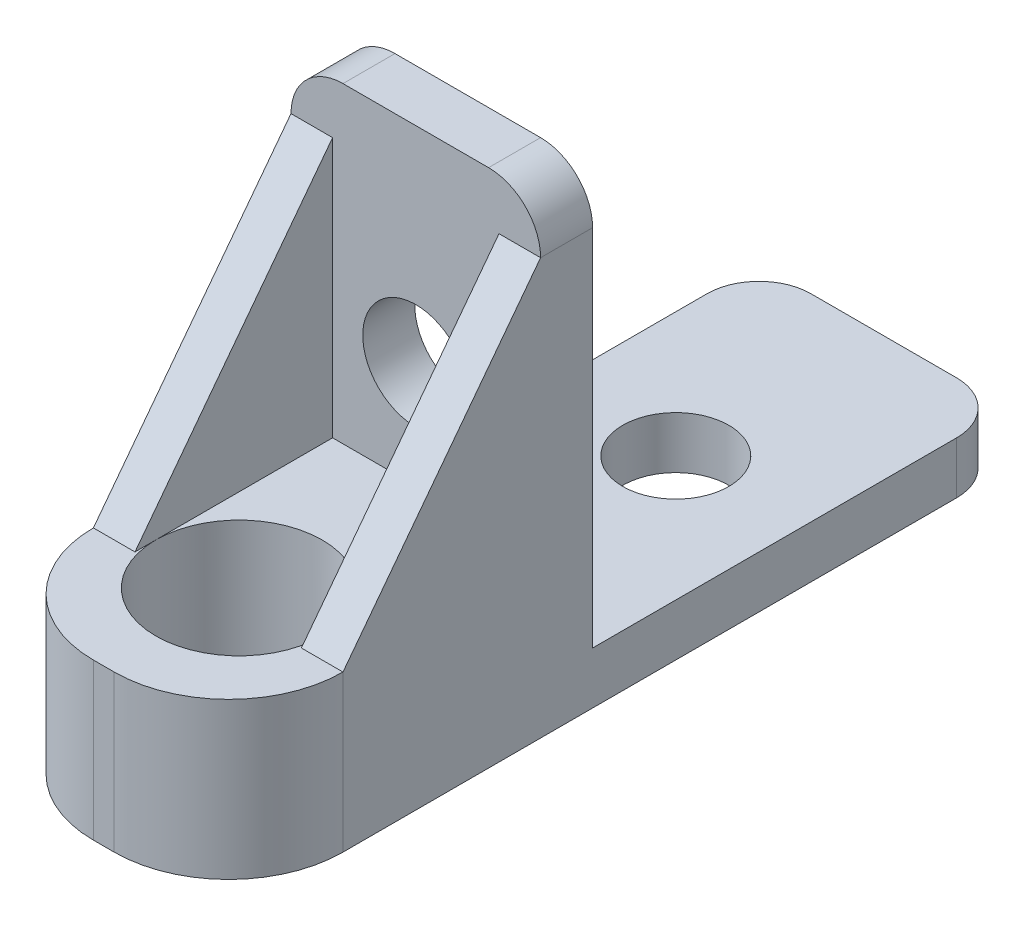
ISO-10303-21;
HEADER;
FILE_DESCRIPTION(('STEP AP214'),'2;1');
FILE_NAME('part.step','',(''),(''),'','','');
FILE_SCHEMA(('AUTOMOTIVE_DESIGN { 1 0 10303 214 1 1 1 1 }'));
ENDSEC;
DATA;
#1=APPLICATION_CONTEXT('core data for automotive mechanical design processes');
#2=APPLICATION_PROTOCOL_DEFINITION('international standard','automotive_design',2000,#1);
#3=PRODUCT_CONTEXT('',#1,'mechanical');
#4=PRODUCT('Part','Part','',(#3));
#5=PRODUCT_RELATED_PRODUCT_CATEGORY('part','',(#4));
#6=PRODUCT_DEFINITION_FORMATION('','',#4);
#7=PRODUCT_DEFINITION_CONTEXT('part definition',#1,'design');
#8=PRODUCT_DEFINITION('design','',#6,#7);
#9=PRODUCT_DEFINITION_SHAPE('','',#8);
#10=(LENGTH_UNIT() NAMED_UNIT(*) SI_UNIT(.MILLI.,.METRE.));
#11=(NAMED_UNIT(*) PLANE_ANGLE_UNIT() SI_UNIT($,.RADIAN.));
#12=(NAMED_UNIT(*) SI_UNIT($,.STERADIAN.) SOLID_ANGLE_UNIT());
#13=UNCERTAINTY_MEASURE_WITH_UNIT(LENGTH_MEASURE(1.E-05),#10,'distance_accuracy_value','');
#14=(GEOMETRIC_REPRESENTATION_CONTEXT(3) GLOBAL_UNCERTAINTY_ASSIGNED_CONTEXT((#13)) GLOBAL_UNIT_ASSIGNED_CONTEXT((#10,
#11,#12)) REPRESENTATION_CONTEXT('',''));
#15=CARTESIAN_POINT('',(0.,0.,0.));
#16=DIRECTION('',(0.,0.,1.));
#17=DIRECTION('',(1.,0.,0.));
#18=AXIS2_PLACEMENT_3D('',#15,#16,#17);
#19=CARTESIAN_POINT('',(5.5,7.5,32.));
#20=DIRECTION('',(0.,1.,0.));
#21=DIRECTION('',(0.,0.,1.));
#22=AXIS2_PLACEMENT_3D('',#19,#20,#21);
#23=PLANE('',#22);
#24=CARTESIAN_POINT('',(6.,7.5,31.));
#25=DIRECTION('',(0.,1.,0.));
#26=DIRECTION('',(0.,0.,1.));
#27=AXIS2_PLACEMENT_3D('',#24,#25,#26);
#28=CIRCLE('',#27,4.00000000000001);
#29=CARTESIAN_POINT('',(10.,7.5,31.));
#30=VERTEX_POINT('',#29);
#31=CARTESIAN_POINT('',(2.,7.5,31.));
#32=VERTEX_POINT('',#31);
#33=EDGE_CURVE('E51',#30,#32,#28,.T.);
#34=ORIENTED_EDGE('',*,*,#33,.F.);
#35=DIRECTION('',(0.,0.,-1.));
#36=VECTOR('',#35,1.);
#37=CARTESIAN_POINT('',(10.,7.5,32.));
#38=LINE('',#37,#36);
#39=CARTESIAN_POINT('',(10.,7.5,22.5));
#40=VERTEX_POINT('',#39);
#41=EDGE_CURVE('E164',#30,#40,#38,.T.);
#42=ORIENTED_EDGE('',*,*,#41,.T.);
#43=DIRECTION('',(-1.,0.,0.));
#44=VECTOR('',#43,1.);
#45=CARTESIAN_POINT('',(12.,7.5,22.5));
#46=LINE('',#45,#44);
#47=CARTESIAN_POINT('',(2.00000000000001,7.5,22.5));
#48=VERTEX_POINT('',#47);
#49=EDGE_CURVE('E193',#40,#48,#46,.T.);
#50=ORIENTED_EDGE('',*,*,#49,.T.);
#51=DIRECTION('',(0.,0.,1.));
#52=VECTOR('',#51,1.);
#53=CARTESIAN_POINT('',(2.,7.5,22.5));
#54=LINE('',#53,#52);
#55=EDGE_CURVE('E167',#48,#32,#54,.T.);
#56=ORIENTED_EDGE('',*,*,#55,.T.);
#57=EDGE_LOOP('',(#34,#42,#50,#56));
#58=FACE_BOUND('',#57,.T.);
#59=ADVANCED_FACE('F37',(#58),#23,.T.);
#60=CARTESIAN_POINT('',(6.50000000000001,2.5,32.));
#61=DIRECTION('',(0.,1.,0.));
#62=DIRECTION('',(0.,0.,1.));
#63=AXIS2_PLACEMENT_3D('',#60,#61,#62);
#64=PLANE('',#63);
#65=DIRECTION('',(-1.,0.,0.));
#66=VECTOR('',#65,1.);
#67=CARTESIAN_POINT('',(0.,2.5,20.));
#68=LINE('',#67,#66);
#69=CARTESIAN_POINT('',(12.,2.5,20.));
#70=VERTEX_POINT('',#69);
#71=CARTESIAN_POINT('',(0.,2.5,20.));
#72=VERTEX_POINT('',#71);
#73=EDGE_CURVE('E212',#70,#72,#68,.T.);
#74=ORIENTED_EDGE('',*,*,#73,.F.);
#75=DIRECTION('',(0.,0.,-1.));
#76=VECTOR('',#75,1.);
#77=CARTESIAN_POINT('',(12.,2.5,2.50000000000002));
#78=LINE('',#77,#76);
#79=CARTESIAN_POINT('',(12.,2.5,2.50000000000002));
#80=VERTEX_POINT('',#79);
#81=EDGE_CURVE('E231',#70,#80,#78,.T.);
#82=ORIENTED_EDGE('',*,*,#81,.T.);
#83=CARTESIAN_POINT('',(9.5,2.5,2.5));
#84=DIRECTION('',(0.,1.,0.));
#85=DIRECTION('',(0.,0.,-1.));
#86=AXIS2_PLACEMENT_3D('',#83,#84,#85);
#87=CIRCLE('',#86,2.5);
#88=CARTESIAN_POINT('',(9.49999999999998,2.5,0.));
#89=VERTEX_POINT('',#88);
#90=EDGE_CURVE('E233',#80,#89,#87,.T.);
#91=ORIENTED_EDGE('',*,*,#90,.T.);
#92=DIRECTION('',(-1.,0.,0.));
#93=VECTOR('',#92,1.);
#94=CARTESIAN_POINT('',(2.50000000000002,2.5,0.));
#95=LINE('',#94,#93);
#96=CARTESIAN_POINT('',(2.5,2.5,0.));
#97=VERTEX_POINT('',#96);
#98=EDGE_CURVE('E236',#89,#97,#95,.T.);
#99=ORIENTED_EDGE('',*,*,#98,.T.);
#100=CARTESIAN_POINT('',(2.5,2.5,2.5));
#101=DIRECTION('',(0.,1.,0.));
#102=DIRECTION('',(0.,0.,-1.));
#103=AXIS2_PLACEMENT_3D('',#100,#101,#102);
#104=CIRCLE('',#103,2.5);
#105=CARTESIAN_POINT('',(0.,2.5,2.50000000000002));
#106=VERTEX_POINT('',#105);
#107=EDGE_CURVE('E238',#97,#106,#104,.T.);
#108=ORIENTED_EDGE('',*,*,#107,.T.);
#109=DIRECTION('',(0.,0.,1.));
#110=VECTOR('',#109,1.);
#111=CARTESIAN_POINT('',(0.,2.5,2.50000000000002));
#112=LINE('',#111,#110);
#113=EDGE_CURVE('E240',#106,#72,#112,.T.);
#114=ORIENTED_EDGE('',*,*,#113,.T.);
#115=EDGE_LOOP('',(#74,#82,#91,#99,#108,#114));
#116=FACE_BOUND('',#115,.T.);
#117=CARTESIAN_POINT('',(6.,2.5,10.));
#118=DIRECTION('',(0.,1.,0.));
#119=DIRECTION('',(0.,0.,1.));
#120=AXIS2_PLACEMENT_3D('',#117,#118,#119);
#121=CIRCLE('',#120,2.55);
#122=CARTESIAN_POINT('',(6.,2.5,12.55));
#123=VERTEX_POINT('',#122);
#124=EDGE_CURVE('E225',#123,#123,#121,.T.);
#125=ORIENTED_EDGE('',*,*,#124,.F.);
#126=EDGE_LOOP('',(#125));
#127=FACE_BOUND('',#126,.T.);
#128=ADVANCED_FACE('F322',(#116,#127),#64,.T.);
#129=CARTESIAN_POINT('',(6.50000000000001,0.,32.));
#130=DIRECTION('',(0.,1.,0.));
#131=DIRECTION('',(0.,0.,1.));
#132=AXIS2_PLACEMENT_3D('',#129,#130,#131);
#133=PLANE('',#132);
#134=CARTESIAN_POINT('',(6.50000000000001,0.,32.));
#135=DIRECTION('',(0.,1.,0.));
#136=DIRECTION('',(0.,0.,1.));
#137=AXIS2_PLACEMENT_3D('',#134,#135,#136);
#138=CIRCLE('',#137,5.5);
#139=CARTESIAN_POINT('',(6.49999999999997,0.,37.5));
#140=VERTEX_POINT('',#139);
#141=CARTESIAN_POINT('',(12.,0.,32.));
#142=VERTEX_POINT('',#141);
#143=EDGE_CURVE('E228',#140,#142,#138,.T.);
#144=ORIENTED_EDGE('',*,*,#143,.F.);
#145=DIRECTION('',(1.,0.,0.));
#146=VECTOR('',#145,1.);
#147=CARTESIAN_POINT('',(5.50000000000004,0.,37.5));
#148=LINE('',#147,#146);
#149=CARTESIAN_POINT('',(5.50000000000004,0.,37.5));
#150=VERTEX_POINT('',#149);
#151=EDGE_CURVE('E234',#150,#140,#148,.T.);
#152=ORIENTED_EDGE('',*,*,#151,.F.);
#153=CARTESIAN_POINT('',(5.5,0.,32.));
#154=DIRECTION('',(0.,1.,0.));
#155=DIRECTION('',(0.,0.,1.));
#156=AXIS2_PLACEMENT_3D('',#153,#154,#155);
#157=CIRCLE('',#156,5.5);
#158=CARTESIAN_POINT('',(0.,0.,32.));
#159=VERTEX_POINT('',#158);
#160=EDGE_CURVE('E256',#159,#150,#157,.T.);
#161=ORIENTED_EDGE('',*,*,#160,.F.);
#162=DIRECTION('',(0.,0.,1.));
#163=VECTOR('',#162,1.);
#164=CARTESIAN_POINT('',(0.,0.,2.50000000000002));
#165=LINE('',#164,#163);
#166=CARTESIAN_POINT('',(0.,0.,2.50000000000002));
#167=VERTEX_POINT('',#166);
#168=EDGE_CURVE('E254',#167,#159,#165,.T.);
#169=ORIENTED_EDGE('',*,*,#168,.F.);
#170=CARTESIAN_POINT('',(2.5,0.,2.5));
#171=DIRECTION('',(0.,1.,0.));
#172=DIRECTION('',(0.,0.,-1.));
#173=AXIS2_PLACEMENT_3D('',#170,#171,#172);
#174=CIRCLE('',#173,2.5);
#175=CARTESIAN_POINT('',(2.5,0.,0.));
#176=VERTEX_POINT('',#175);
#177=EDGE_CURVE('E252',#176,#167,#174,.T.);
#178=ORIENTED_EDGE('',*,*,#177,.F.);
#179=DIRECTION('',(-1.,0.,0.));
#180=VECTOR('',#179,1.);
#181=CARTESIAN_POINT('',(2.50000000000002,0.,0.));
#182=LINE('',#181,#180);
#183=CARTESIAN_POINT('',(9.49999999999998,0.,0.));
#184=VERTEX_POINT('',#183);
#185=EDGE_CURVE('E250',#184,#176,#182,.T.);
#186=ORIENTED_EDGE('',*,*,#185,.F.);
#187=CARTESIAN_POINT('',(9.5,0.,2.5));
#188=DIRECTION('',(0.,1.,0.));
#189=DIRECTION('',(0.,0.,-1.));
#190=AXIS2_PLACEMENT_3D('',#187,#188,#189);
#191=CIRCLE('',#190,2.5);
#192=CARTESIAN_POINT('',(12.,0.,2.50000000000002));
#193=VERTEX_POINT('',#192);
#194=EDGE_CURVE('E248',#193,#184,#191,.T.);
#195=ORIENTED_EDGE('',*,*,#194,.F.);
#196=DIRECTION('',(0.,0.,-1.));
#197=VECTOR('',#196,1.);
#198=CARTESIAN_POINT('',(12.,0.,2.50000000000002));
#199=LINE('',#198,#197);
#200=EDGE_CURVE('E246',#142,#193,#199,.T.);
#201=ORIENTED_EDGE('',*,*,#200,.F.);
#202=EDGE_LOOP('',(#144,#152,#161,#169,#178,#186,#195,#201));
#203=FACE_BOUND('',#202,.T.);
#204=CARTESIAN_POINT('',(6.,0.,10.));
#205=DIRECTION('',(0.,1.,0.));
#206=DIRECTION('',(0.,0.,1.));
#207=AXIS2_PLACEMENT_3D('',#204,#205,#206);
#208=CIRCLE('',#207,2.55);
#209=CARTESIAN_POINT('',(6.,0.,12.55));
#210=VERTEX_POINT('',#209);
#211=EDGE_CURVE('E224',#210,#210,#208,.T.);
#212=ORIENTED_EDGE('',*,*,#211,.T.);
#213=EDGE_LOOP('',(#212));
#214=FACE_BOUND('',#213,.T.);
#215=CARTESIAN_POINT('',(6.,0.,31.));
#216=DIRECTION('',(0.,1.,0.));
#217=DIRECTION('',(0.,0.,1.));
#218=AXIS2_PLACEMENT_3D('',#215,#216,#217);
#219=CIRCLE('',#218,4.);
#220=CARTESIAN_POINT('',(6.,0.,35.));
#221=VERTEX_POINT('',#220);
#222=EDGE_CURVE('E221',#221,#221,#219,.T.);
#223=ORIENTED_EDGE('',*,*,#222,.T.);
#224=EDGE_LOOP('',(#223));
#225=FACE_BOUND('',#224,.T.);
#226=ADVANCED_FACE('F361',(#203,#214,#225),#133,.F.);
#227=CARTESIAN_POINT('',(6.50000000000001,2.5,32.));
#228=DIRECTION('',(0.,-1.,0.));
#229=DIRECTION('',(0.,0.,-1.));
#230=AXIS2_PLACEMENT_3D('',#227,#228,#229);
#231=CYLINDRICAL_SURFACE('',#230,5.5);
#232=ORIENTED_EDGE('',*,*,#143,.T.);
#233=DIRECTION('',(0.,-1.,0.));
#234=VECTOR('',#233,1.);
#235=CARTESIAN_POINT('',(12.,2.5,32.));
#236=LINE('',#235,#234);
#237=CARTESIAN_POINT('',(12.,7.5,32.));
#238=VERTEX_POINT('',#237);
#239=EDGE_CURVE('E279',#238,#142,#236,.T.);
#240=ORIENTED_EDGE('',*,*,#239,.F.);
#241=CARTESIAN_POINT('',(6.50000000000001,7.5,32.));
#242=DIRECTION('',(0.,1.,0.));
#243=DIRECTION('',(0.,0.,1.));
#244=AXIS2_PLACEMENT_3D('',#241,#242,#243);
#245=CIRCLE('',#244,5.5);
#246=CARTESIAN_POINT('',(6.49999999999997,7.5,37.5));
#247=VERTEX_POINT('',#246);
#248=EDGE_CURVE('E202',#247,#238,#245,.T.);
#249=ORIENTED_EDGE('',*,*,#248,.F.);
#250=DIRECTION('',(0.,-1.,0.));
#251=VECTOR('',#250,1.);
#252=CARTESIAN_POINT('',(6.49999999999997,2.5,37.5));
#253=LINE('',#252,#251);
#254=EDGE_CURVE('E243',#247,#140,#253,.T.);
#255=ORIENTED_EDGE('',*,*,#254,.T.);
#256=EDGE_LOOP('',(#232,#240,#249,#255));
#257=FACE_BOUND('',#256,.T.);
#258=ADVANCED_FACE('F380',(#257),#231,.T.);
#259=CARTESIAN_POINT('',(12.,2.5,2.50000000000002));
#260=DIRECTION('',(-1.,0.,0.));
#261=DIRECTION('',(0.,0.,1.));
#262=AXIS2_PLACEMENT_3D('',#259,#260,#261);
#263=PLANE('',#262);
#264=DIRECTION('',(0.,-1.,0.));
#265=VECTOR('',#264,1.);
#266=CARTESIAN_POINT('',(12.,22.5,20.));
#267=LINE('',#266,#265);
#268=CARTESIAN_POINT('',(12.,20.,20.));
#269=VERTEX_POINT('',#268);
#270=EDGE_CURVE('E219',#269,#70,#267,.T.);
#271=ORIENTED_EDGE('',*,*,#270,.F.);
#272=DIRECTION('',(0.,0.,-1.));
#273=VECTOR('',#272,1.);
#274=CARTESIAN_POINT('',(12.,20.,22.5));
#275=LINE('',#274,#273);
#276=CARTESIAN_POINT('',(12.,20.,22.5));
#277=VERTEX_POINT('',#276);
#278=EDGE_CURVE('E294',#269,#277,#275,.F.);
#279=ORIENTED_EDGE('',*,*,#278,.T.);
#280=DIRECTION('',(0.,-0.796162194123102,0.605083267533558));
#281=VECTOR('',#280,1.);
#282=CARTESIAN_POINT('',(12.,20.,22.5));
#283=LINE('',#282,#281);
#284=EDGE_CURVE('E187',#277,#238,#283,.T.);
#285=ORIENTED_EDGE('',*,*,#284,.T.);
#286=ORIENTED_EDGE('',*,*,#239,.T.);
#287=ORIENTED_EDGE('',*,*,#200,.T.);
#288=DIRECTION('',(0.,-1.,0.));
#289=VECTOR('',#288,1.);
#290=CARTESIAN_POINT('',(12.,2.5,2.50000000000002));
#291=LINE('',#290,#289);
#292=EDGE_CURVE('E276',#80,#193,#291,.T.);
#293=ORIENTED_EDGE('',*,*,#292,.F.);
#294=ORIENTED_EDGE('',*,*,#81,.F.);
#295=EDGE_LOOP('',(#271,#279,#285,#286,#287,#293,#294));
#296=FACE_BOUND('',#295,.T.);
#297=ADVANCED_FACE('F318',(#296),#263,.F.);
#298=CARTESIAN_POINT('',(9.5,2.5,2.5));
#299=DIRECTION('',(0.,-1.,0.));
#300=DIRECTION('',(0.,0.,-1.));
#301=AXIS2_PLACEMENT_3D('',#298,#299,#300);
#302=CYLINDRICAL_SURFACE('',#301,2.5);
#303=ORIENTED_EDGE('',*,*,#194,.T.);
#304=DIRECTION('',(0.,-1.,0.));
#305=VECTOR('',#304,1.);
#306=CARTESIAN_POINT('',(9.49999999999998,2.5,0.));
#307=LINE('',#306,#305);
#308=EDGE_CURVE('E273',#89,#184,#307,.T.);
#309=ORIENTED_EDGE('',*,*,#308,.F.);
#310=ORIENTED_EDGE('',*,*,#90,.F.);
#311=ORIENTED_EDGE('',*,*,#292,.T.);
#312=EDGE_LOOP('',(#303,#309,#310,#311));
#313=FACE_BOUND('',#312,.T.);
#314=ADVANCED_FACE('F386',(#313),#302,.T.);
#315=CARTESIAN_POINT('',(2.50000000000002,2.5,0.));
#316=DIRECTION('',(0.,0.,1.));
#317=DIRECTION('',(1.,0.,0.));
#318=AXIS2_PLACEMENT_3D('',#315,#316,#317);
#319=PLANE('',#318);
#320=ORIENTED_EDGE('',*,*,#185,.T.);
#321=DIRECTION('',(0.,-1.,0.));
#322=VECTOR('',#321,1.);
#323=CARTESIAN_POINT('',(2.5,2.5,0.));
#324=LINE('',#323,#322);
#325=EDGE_CURVE('E270',#97,#176,#324,.T.);
#326=ORIENTED_EDGE('',*,*,#325,.F.);
#327=ORIENTED_EDGE('',*,*,#98,.F.);
#328=ORIENTED_EDGE('',*,*,#308,.T.);
#329=EDGE_LOOP('',(#320,#326,#327,#328));
#330=FACE_BOUND('',#329,.T.);
#331=ADVANCED_FACE('F389',(#330),#319,.F.);
#332=CARTESIAN_POINT('',(2.5,2.5,2.5));
#333=DIRECTION('',(0.,-1.,0.));
#334=DIRECTION('',(0.,0.,-1.));
#335=AXIS2_PLACEMENT_3D('',#332,#333,#334);
#336=CYLINDRICAL_SURFACE('',#335,2.5);
#337=ORIENTED_EDGE('',*,*,#177,.T.);
#338=DIRECTION('',(0.,-1.,0.));
#339=VECTOR('',#338,1.);
#340=CARTESIAN_POINT('',(0.,2.5,2.50000000000002));
#341=LINE('',#340,#339);
#342=EDGE_CURVE('E267',#106,#167,#341,.T.);
#343=ORIENTED_EDGE('',*,*,#342,.F.);
#344=ORIENTED_EDGE('',*,*,#107,.F.);
#345=ORIENTED_EDGE('',*,*,#325,.T.);
#346=EDGE_LOOP('',(#337,#343,#344,#345));
#347=FACE_BOUND('',#346,.T.);
#348=ADVANCED_FACE('F393',(#347),#336,.T.);
#349=CARTESIAN_POINT('',(0.,2.5,2.50000000000002));
#350=DIRECTION('',(1.,0.,0.));
#351=DIRECTION('',(0.,0.,-1.));
#352=AXIS2_PLACEMENT_3D('',#349,#350,#351);
#353=PLANE('',#352);
#354=DIRECTION('',(0.,-1.,0.));
#355=VECTOR('',#354,1.);
#356=CARTESIAN_POINT('',(0.,2.5,32.));
#357=LINE('',#356,#355);
#358=CARTESIAN_POINT('',(0.,7.5,32.));
#359=VERTEX_POINT('',#358);
#360=EDGE_CURVE('E264',#359,#159,#357,.T.);
#361=ORIENTED_EDGE('',*,*,#360,.F.);
#362=DIRECTION('',(0.,0.796162194123104,-0.605083267533556));
#363=VECTOR('',#362,1.);
#364=CARTESIAN_POINT('',(0.,7.5,32.));
#365=LINE('',#364,#363);
#366=CARTESIAN_POINT('',(0.,20.,22.5));
#367=VERTEX_POINT('',#366);
#368=EDGE_CURVE('E168',#359,#367,#365,.T.);
#369=ORIENTED_EDGE('',*,*,#368,.T.);
#370=DIRECTION('',(0.,0.,1.));
#371=VECTOR('',#370,1.);
#372=CARTESIAN_POINT('',(0.,20.,20.));
#373=LINE('',#372,#371);
#374=CARTESIAN_POINT('',(0.,20.,20.));
#375=VERTEX_POINT('',#374);
#376=EDGE_CURVE('E11',#367,#375,#373,.F.);
#377=ORIENTED_EDGE('',*,*,#376,.T.);
#378=DIRECTION('',(0.,-1.,0.));
#379=VECTOR('',#378,1.);
#380=CARTESIAN_POINT('',(0.,22.5,20.));
#381=LINE('',#380,#379);
#382=EDGE_CURVE('E215',#375,#72,#381,.T.);
#383=ORIENTED_EDGE('',*,*,#382,.T.);
#384=ORIENTED_EDGE('',*,*,#113,.F.);
#385=ORIENTED_EDGE('',*,*,#342,.T.);
#386=ORIENTED_EDGE('',*,*,#168,.T.);
#387=EDGE_LOOP('',(#361,#369,#377,#383,#384,#385,#386));
#388=FACE_BOUND('',#387,.T.);
#389=ADVANCED_FACE('F397',(#388),#353,.F.);
#390=CARTESIAN_POINT('',(5.5,2.5,32.));
#391=DIRECTION('',(0.,-1.,0.));
#392=DIRECTION('',(0.,0.,-1.));
#393=AXIS2_PLACEMENT_3D('',#390,#391,#392);
#394=CYLINDRICAL_SURFACE('',#393,5.5);
#395=ORIENTED_EDGE('',*,*,#160,.T.);
#396=DIRECTION('',(0.,-1.,0.));
#397=VECTOR('',#396,1.);
#398=CARTESIAN_POINT('',(5.50000000000004,2.5,37.5));
#399=LINE('',#398,#397);
#400=CARTESIAN_POINT('',(5.5,7.5,37.5));
#401=VERTEX_POINT('',#400);
#402=EDGE_CURVE('E261',#401,#150,#399,.T.);
#403=ORIENTED_EDGE('',*,*,#402,.F.);
#404=CARTESIAN_POINT('',(5.5,7.5,32.));
#405=DIRECTION('',(0.,1.,0.));
#406=DIRECTION('',(0.,0.,1.));
#407=AXIS2_PLACEMENT_3D('',#404,#405,#406);
#408=CIRCLE('',#407,5.5);
#409=EDGE_CURVE('E196',#359,#401,#408,.T.);
#410=ORIENTED_EDGE('',*,*,#409,.F.);
#411=ORIENTED_EDGE('',*,*,#360,.T.);
#412=EDGE_LOOP('',(#395,#403,#410,#411));
#413=FACE_BOUND('',#412,.T.);
#414=ADVANCED_FACE('F401',(#413),#394,.T.);
#415=CARTESIAN_POINT('',(5.50000000000004,2.5,37.5));
#416=DIRECTION('',(0.,0.,-1.));
#417=DIRECTION('',(-1.,0.,0.));
#418=AXIS2_PLACEMENT_3D('',#415,#416,#417);
#419=PLANE('',#418);
#420=ORIENTED_EDGE('',*,*,#151,.T.);
#421=ORIENTED_EDGE('',*,*,#254,.F.);
#422=DIRECTION('',(1.,0.,0.));
#423=VECTOR('',#422,1.);
#424=CARTESIAN_POINT('',(5.50000000000004,7.5,37.5));
#425=LINE('',#424,#423);
#426=EDGE_CURVE('E199',#401,#247,#425,.T.);
#427=ORIENTED_EDGE('',*,*,#426,.F.);
#428=ORIENTED_EDGE('',*,*,#402,.T.);
#429=EDGE_LOOP('',(#420,#421,#427,#428));
#430=FACE_BOUND('',#429,.T.);
#431=ADVANCED_FACE('F404',(#430),#419,.F.);
#432=CARTESIAN_POINT('',(6.,2.5,10.));
#433=DIRECTION('',(0.,-1.,0.));
#434=DIRECTION('',(0.,0.,-1.));
#435=AXIS2_PLACEMENT_3D('',#432,#433,#434);
#436=CYLINDRICAL_SURFACE('',#435,2.55);
#437=ORIENTED_EDGE('',*,*,#124,.T.);
#438=EDGE_LOOP('',(#437));
#439=FACE_BOUND('',#438,.T.);
#440=ORIENTED_EDGE('',*,*,#211,.F.);
#441=EDGE_LOOP('',(#440));
#442=FACE_BOUND('',#441,.T.);
#443=ADVANCED_FACE('F408',(#439,#442),#436,.F.);
#444=CARTESIAN_POINT('',(6.,2.5,31.));
#445=DIRECTION('',(0.,-1.,0.));
#446=DIRECTION('',(0.,0.,-1.));
#447=AXIS2_PLACEMENT_3D('',#444,#445,#446);
#448=CYLINDRICAL_SURFACE('',#447,4.);
#449=ORIENTED_EDGE('',*,*,#222,.F.);
#450=EDGE_LOOP('',(#449));
#451=FACE_BOUND('',#450,.T.);
#452=ORIENTED_EDGE('',*,*,#33,.T.);
#453=EDGE_CURVE('E154',#32,#30,#28,.T.);
#454=ORIENTED_EDGE('',*,*,#453,.T.);
#455=EDGE_LOOP('',(#452,#454));
#456=FACE_BOUND('',#455,.T.);
#457=ADVANCED_FACE('F155',(#451,#456),#448,.F.);
#458=CARTESIAN_POINT('',(0.,22.5,22.5));
#459=DIRECTION('',(0.,0.,-1.));
#460=DIRECTION('',(-1.,0.,0.));
#461=AXIS2_PLACEMENT_3D('',#458,#459,#460);
#462=PLANE('',#461);
#463=CARTESIAN_POINT('',(6.00000000000001,12.5,22.5));
#464=DIRECTION('',(0.,0.,1.));
#465=DIRECTION('',(1.,0.,0.));
#466=AXIS2_PLACEMENT_3D('',#463,#464,#465);
#467=CIRCLE('',#466,2.55);
#468=CARTESIAN_POINT('',(8.55000000000001,12.5,22.5));
#469=VERTEX_POINT('',#468);
#470=EDGE_CURVE('E204',#469,#469,#467,.T.);
#471=ORIENTED_EDGE('',*,*,#470,.F.);
#472=EDGE_LOOP('',(#471));
#473=FACE_BOUND('',#472,.T.);
#474=CARTESIAN_POINT('',(2.5,20.,22.5));
#475=DIRECTION('',(0.,0.,-1.));
#476=DIRECTION('',(-1.,0.,0.));
#477=AXIS2_PLACEMENT_3D('',#474,#475,#476);
#478=CIRCLE('',#477,2.5);
#479=CARTESIAN_POINT('',(2.5,22.5,22.5));
#480=VERTEX_POINT('',#479);
#481=EDGE_CURVE('E297',#480,#367,#478,.F.);
#482=ORIENTED_EDGE('',*,*,#481,.T.);
#483=DIRECTION('',(-1.,0.,0.));
#484=VECTOR('',#483,1.);
#485=CARTESIAN_POINT('',(2.,20.,22.5));
#486=LINE('',#485,#484);
#487=CARTESIAN_POINT('',(2.,20.,22.5));
#488=VERTEX_POINT('',#487);
#489=EDGE_CURVE('E190',#488,#367,#486,.T.);
#490=ORIENTED_EDGE('',*,*,#489,.F.);
#491=DIRECTION('',(0.,-1.,0.));
#492=VECTOR('',#491,1.);
#493=CARTESIAN_POINT('',(2.,20.,22.5));
#494=LINE('',#493,#492);
#495=EDGE_CURVE('E332',#488,#48,#494,.T.);
#496=ORIENTED_EDGE('',*,*,#495,.T.);
#497=ORIENTED_EDGE('',*,*,#49,.F.);
#498=DIRECTION('',(0.,1.,0.));
#499=VECTOR('',#498,1.);
#500=CARTESIAN_POINT('',(10.,7.5,22.5));
#501=LINE('',#500,#499);
#502=CARTESIAN_POINT('',(10.,20.,22.5));
#503=VERTEX_POINT('',#502);
#504=EDGE_CURVE('E175',#40,#503,#501,.T.);
#505=ORIENTED_EDGE('',*,*,#504,.T.);
#506=DIRECTION('',(1.,0.,0.));
#507=VECTOR('',#506,1.);
#508=CARTESIAN_POINT('',(10.,20.,22.5));
#509=LINE('',#508,#507);
#510=EDGE_CURVE('E191',#503,#277,#509,.T.);
#511=ORIENTED_EDGE('',*,*,#510,.T.);
#512=CARTESIAN_POINT('',(9.5,20.,22.5));
#513=DIRECTION('',(0.,0.,-1.));
#514=DIRECTION('',(-1.,0.,0.));
#515=AXIS2_PLACEMENT_3D('',#512,#513,#514);
#516=CIRCLE('',#515,2.5);
#517=CARTESIAN_POINT('',(9.5,22.5,22.5));
#518=VERTEX_POINT('',#517);
#519=EDGE_CURVE('E45',#277,#518,#516,.F.);
#520=ORIENTED_EDGE('',*,*,#519,.T.);
#521=DIRECTION('',(1.,0.,0.));
#522=VECTOR('',#521,1.);
#523=CARTESIAN_POINT('',(0.,22.5,22.5));
#524=LINE('',#523,#522);
#525=EDGE_CURVE('E208',#480,#518,#524,.T.);
#526=ORIENTED_EDGE('',*,*,#525,.F.);
#527=EDGE_LOOP('',(#482,#490,#496,#497,#505,#511,#520,#526));
#528=FACE_BOUND('',#527,.T.);
#529=ADVANCED_FACE('F301',(#473,#528),#462,.F.);
#530=CARTESIAN_POINT('',(0.,22.5,20.));
#531=DIRECTION('',(0.,0.,1.));
#532=DIRECTION('',(1.,0.,0.));
#533=AXIS2_PLACEMENT_3D('',#530,#531,#532);
#534=PLANE('',#533);
#535=CARTESIAN_POINT('',(6.00000000000001,12.5,20.));
#536=DIRECTION('',(0.,0.,1.));
#537=DIRECTION('',(1.,0.,0.));
#538=AXIS2_PLACEMENT_3D('',#535,#536,#537);
#539=CIRCLE('',#538,2.55);
#540=CARTESIAN_POINT('',(8.55000000000001,12.5,20.));
#541=VERTEX_POINT('',#540);
#542=EDGE_CURVE('E207',#541,#541,#539,.T.);
#543=ORIENTED_EDGE('',*,*,#542,.T.);
#544=EDGE_LOOP('',(#543));
#545=FACE_BOUND('',#544,.T.);
#546=DIRECTION('',(-1.,0.,0.));
#547=VECTOR('',#546,1.);
#548=CARTESIAN_POINT('',(0.,22.5,20.));
#549=LINE('',#548,#547);
#550=CARTESIAN_POINT('',(9.5,22.5,20.));
#551=VERTEX_POINT('',#550);
#552=CARTESIAN_POINT('',(2.5,22.5,20.));
#553=VERTEX_POINT('',#552);
#554=EDGE_CURVE('E211',#551,#553,#549,.T.);
#555=ORIENTED_EDGE('',*,*,#554,.F.);
#556=CARTESIAN_POINT('',(9.5,20.,20.));
#557=DIRECTION('',(0.,0.,1.));
#558=DIRECTION('',(1.,0.,0.));
#559=AXIS2_PLACEMENT_3D('',#556,#557,#558);
#560=CIRCLE('',#559,2.5);
#561=EDGE_CURVE('E292',#551,#269,#560,.F.);
#562=ORIENTED_EDGE('',*,*,#561,.T.);
#563=ORIENTED_EDGE('',*,*,#270,.T.);
#564=ORIENTED_EDGE('',*,*,#73,.T.);
#565=ORIENTED_EDGE('',*,*,#382,.F.);
#566=CARTESIAN_POINT('',(2.5,20.,20.));
#567=DIRECTION('',(0.,0.,1.));
#568=DIRECTION('',(1.,0.,0.));
#569=AXIS2_PLACEMENT_3D('',#566,#567,#568);
#570=CIRCLE('',#569,2.5);
#571=EDGE_CURVE('E290',#375,#553,#570,.F.);
#572=ORIENTED_EDGE('',*,*,#571,.T.);
#573=EDGE_LOOP('',(#555,#562,#563,#564,#565,#572));
#574=FACE_BOUND('',#573,.T.);
#575=ADVANCED_FACE('F314',(#545,#574),#534,.F.);
#576=CARTESIAN_POINT('',(0.,22.5,0.));
#577=DIRECTION('',(0.,1.,0.));
#578=DIRECTION('',(0.,0.,1.));
#579=AXIS2_PLACEMENT_3D('',#576,#577,#578);
#580=PLANE('',#579);
#581=ORIENTED_EDGE('',*,*,#525,.T.);
#582=DIRECTION('',(0.,0.,-1.));
#583=VECTOR('',#582,1.);
#584=CARTESIAN_POINT('',(9.5,22.5,20.));
#585=LINE('',#584,#583);
#586=EDGE_CURVE('E287',#518,#551,#585,.T.);
#587=ORIENTED_EDGE('',*,*,#586,.T.);
#588=ORIENTED_EDGE('',*,*,#554,.T.);
#589=DIRECTION('',(0.,0.,1.));
#590=VECTOR('',#589,1.);
#591=CARTESIAN_POINT('',(2.5,22.5,22.5));
#592=LINE('',#591,#590);
#593=EDGE_CURVE('E282',#553,#480,#592,.T.);
#594=ORIENTED_EDGE('',*,*,#593,.T.);
#595=EDGE_LOOP('',(#581,#587,#588,#594));
#596=FACE_BOUND('',#595,.T.);
#597=ADVANCED_FACE('F308',(#596),#580,.T.);
#598=CARTESIAN_POINT('',(6.00000000000001,12.5,2.5));
#599=DIRECTION('',(0.,0.,1.));
#600=DIRECTION('',(1.,0.,0.));
#601=AXIS2_PLACEMENT_3D('',#598,#599,#600);
#602=CYLINDRICAL_SURFACE('',#601,2.55);
#603=ORIENTED_EDGE('',*,*,#470,.T.);
#604=EDGE_LOOP('',(#603));
#605=FACE_BOUND('',#604,.T.);
#606=ORIENTED_EDGE('',*,*,#542,.F.);
#607=EDGE_LOOP('',(#606));
#608=FACE_BOUND('',#607,.T.);
#609=ADVANCED_FACE('F374',(#605,#608),#602,.F.);
#610=CARTESIAN_POINT('',(9.5,20.,0.));
#611=DIRECTION('',(0.,0.,1.));
#612=DIRECTION('',(1.,0.,0.));
#613=AXIS2_PLACEMENT_3D('',#610,#611,#612);
#614=CYLINDRICAL_SURFACE('',#613,2.5);
#615=ORIENTED_EDGE('',*,*,#519,.F.);
#616=ORIENTED_EDGE('',*,*,#278,.F.);
#617=ORIENTED_EDGE('',*,*,#561,.F.);
#618=ORIENTED_EDGE('',*,*,#586,.F.);
#619=EDGE_LOOP('',(#615,#616,#617,#618));
#620=FACE_BOUND('',#619,.T.);
#621=ADVANCED_FACE('F311',(#620),#614,.T.);
#622=CARTESIAN_POINT('',(2.5,20.,0.));
#623=DIRECTION('',(0.,0.,-1.));
#624=DIRECTION('',(-1.,0.,0.));
#625=AXIS2_PLACEMENT_3D('',#622,#623,#624);
#626=CYLINDRICAL_SURFACE('',#625,2.5);
#627=ORIENTED_EDGE('',*,*,#571,.F.);
#628=ORIENTED_EDGE('',*,*,#376,.F.);
#629=ORIENTED_EDGE('',*,*,#481,.F.);
#630=ORIENTED_EDGE('',*,*,#593,.F.);
#631=EDGE_LOOP('',(#627,#628,#629,#630));
#632=FACE_BOUND('',#631,.T.);
#633=ADVANCED_FACE('F39',(#632),#626,.T.);
#634=ORIENTED_EDGE('',*,*,#453,.F.);
#635=CARTESIAN_POINT('',(2.,7.5,32.));
#636=VERTEX_POINT('',#635);
#637=EDGE_CURVE('E344',#32,#636,#54,.T.);
#638=ORIENTED_EDGE('',*,*,#637,.T.);
#639=DIRECTION('',(-1.,0.,0.));
#640=VECTOR('',#639,1.);
#641=CARTESIAN_POINT('',(2.,7.5,32.));
#642=LINE('',#641,#640);
#643=EDGE_CURVE('E335',#636,#359,#642,.T.);
#644=ORIENTED_EDGE('',*,*,#643,.T.);
#645=ORIENTED_EDGE('',*,*,#409,.T.);
#646=ORIENTED_EDGE('',*,*,#426,.T.);
#647=ORIENTED_EDGE('',*,*,#248,.T.);
#648=DIRECTION('',(1.,0.,0.));
#649=VECTOR('',#648,1.);
#650=CARTESIAN_POINT('',(10.,7.5,32.));
#651=LINE('',#650,#649);
#652=CARTESIAN_POINT('',(10.,7.5,32.));
#653=VERTEX_POINT('',#652);
#654=EDGE_CURVE('E182',#653,#238,#651,.T.);
#655=ORIENTED_EDGE('',*,*,#654,.F.);
#656=EDGE_CURVE('E174',#653,#30,#38,.T.);
#657=ORIENTED_EDGE('',*,*,#656,.T.);
#658=EDGE_LOOP('',(#634,#638,#644,#645,#646,#647,#655,#657));
#659=FACE_BOUND('',#658,.T.);
#660=ADVANCED_FACE('F179',(#659),#23,.T.);
#661=CARTESIAN_POINT('',(10.,20.,22.5));
#662=DIRECTION('',(0.,0.605083267533558,0.796162194123103));
#663=DIRECTION('',(0.,-0.796162194123103,0.605083267533558));
#664=AXIS2_PLACEMENT_3D('',#661,#662,#663);
#665=PLANE('',#664);
#666=ORIENTED_EDGE('',*,*,#284,.F.);
#667=ORIENTED_EDGE('',*,*,#510,.F.);
#668=DIRECTION('',(0.,-0.796162194123102,0.605083267533558));
#669=VECTOR('',#668,1.);
#670=CARTESIAN_POINT('',(10.,20.,22.5));
#671=LINE('',#670,#669);
#672=EDGE_CURVE('E176',#503,#653,#671,.T.);
#673=ORIENTED_EDGE('',*,*,#672,.T.);
#674=ORIENTED_EDGE('',*,*,#654,.T.);
#675=EDGE_LOOP('',(#666,#667,#673,#674));
#676=FACE_BOUND('',#675,.T.);
#677=ADVANCED_FACE('F354',(#676),#665,.T.);
#678=CARTESIAN_POINT('',(10.,0.,0.));
#679=DIRECTION('',(1.,0.,0.));
#680=DIRECTION('',(0.,0.,-1.));
#681=AXIS2_PLACEMENT_3D('',#678,#679,#680);
#682=PLANE('',#681);
#683=ORIENTED_EDGE('',*,*,#656,.F.);
#684=ORIENTED_EDGE('',*,*,#672,.F.);
#685=ORIENTED_EDGE('',*,*,#504,.F.);
#686=ORIENTED_EDGE('',*,*,#41,.F.);
#687=EDGE_LOOP('',(#683,#684,#685,#686));
#688=FACE_BOUND('',#687,.T.);
#689=ADVANCED_FACE('F172',(#688),#682,.F.);
#690=CARTESIAN_POINT('',(2.,7.5,32.));
#691=DIRECTION('',(0.,0.605083267533556,0.796162194123104));
#692=DIRECTION('',(0.,-0.796162194123104,0.605083267533556));
#693=AXIS2_PLACEMENT_3D('',#690,#691,#692);
#694=PLANE('',#693);
#695=ORIENTED_EDGE('',*,*,#368,.F.);
#696=ORIENTED_EDGE('',*,*,#643,.F.);
#697=DIRECTION('',(0.,0.796162194123104,-0.605083267533556));
#698=VECTOR('',#697,1.);
#699=CARTESIAN_POINT('',(2.,7.5,32.));
#700=LINE('',#699,#698);
#701=EDGE_CURVE('E59',#636,#488,#700,.T.);
#702=ORIENTED_EDGE('',*,*,#701,.T.);
#703=ORIENTED_EDGE('',*,*,#489,.T.);
#704=EDGE_LOOP('',(#695,#696,#702,#703));
#705=FACE_BOUND('',#704,.T.);
#706=ADVANCED_FACE('F346',(#705),#694,.T.);
#707=CARTESIAN_POINT('',(2.,0.,0.));
#708=DIRECTION('',(1.,0.,0.));
#709=DIRECTION('',(0.,0.,-1.));
#710=AXIS2_PLACEMENT_3D('',#707,#708,#709);
#711=PLANE('',#710);
#712=ORIENTED_EDGE('',*,*,#637,.F.);
#713=ORIENTED_EDGE('',*,*,#55,.F.);
#714=ORIENTED_EDGE('',*,*,#495,.F.);
#715=ORIENTED_EDGE('',*,*,#701,.F.);
#716=EDGE_LOOP('',(#712,#713,#714,#715));
#717=FACE_BOUND('',#716,.T.);
#718=ADVANCED_FACE('F338',(#717),#711,.T.);
#719=CLOSED_SHELL('',(#59,#128,#226,#258,#297,#314,#331,#348,#389,#414,#431,#443,#457,#529,#575,
#597,#609,#621,#633,#660,#677,#689,#706,#718));
#720=MANIFOLD_SOLID_BREP('B2',#719);
#721=ADVANCED_BREP_SHAPE_REPRESENTATION('',(#18,#720),#14);
#722=SHAPE_DEFINITION_REPRESENTATION(#9,#721);
ENDSEC;
END-ISO-10303-21;
